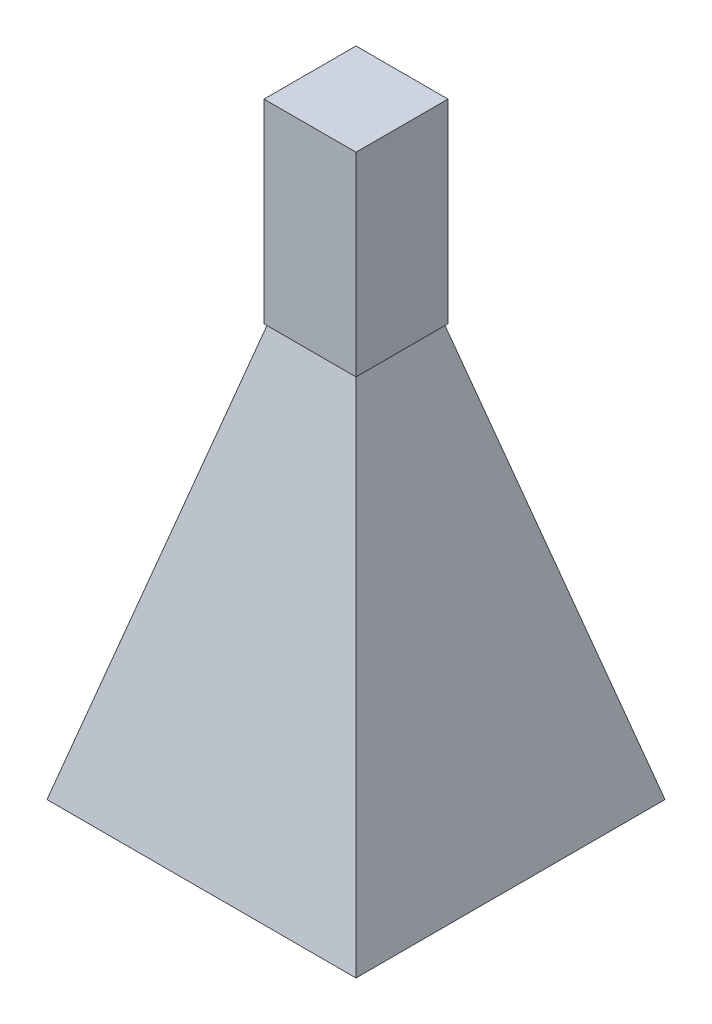
ISO-10303-21;
HEADER;
FILE_DESCRIPTION(('STEP AP214'),'2;1');
FILE_NAME('part.step','',(''),(''),'','','');
FILE_SCHEMA(('AUTOMOTIVE_DESIGN { 1 0 10303 214 1 1 1 1 }'));
ENDSEC;
DATA;
#1=APPLICATION_CONTEXT('core data for automotive mechanical design processes');
#2=APPLICATION_PROTOCOL_DEFINITION('international standard','automotive_design',2000,#1);
#3=PRODUCT_CONTEXT('',#1,'mechanical');
#4=PRODUCT('Part','Part','',(#3));
#5=PRODUCT_RELATED_PRODUCT_CATEGORY('part','',(#4));
#6=PRODUCT_DEFINITION_FORMATION('','',#4);
#7=PRODUCT_DEFINITION_CONTEXT('part definition',#1,'design');
#8=PRODUCT_DEFINITION('design','',#6,#7);
#9=PRODUCT_DEFINITION_SHAPE('','',#8);
#10=(LENGTH_UNIT() NAMED_UNIT(*) SI_UNIT(.MILLI.,.METRE.));
#11=(NAMED_UNIT(*) PLANE_ANGLE_UNIT() SI_UNIT($,.RADIAN.));
#12=(NAMED_UNIT(*) SI_UNIT($,.STERADIAN.) SOLID_ANGLE_UNIT());
#13=UNCERTAINTY_MEASURE_WITH_UNIT(LENGTH_MEASURE(1.E-05),#10,'distance_accuracy_value','');
#14=(GEOMETRIC_REPRESENTATION_CONTEXT(3) GLOBAL_UNCERTAINTY_ASSIGNED_CONTEXT((#13)) GLOBAL_UNIT_ASSIGNED_CONTEXT((#10,
#11,#12)) REPRESENTATION_CONTEXT('',''));
#15=CARTESIAN_POINT('',(0.,0.,0.));
#16=DIRECTION('',(0.,0.,1.));
#17=DIRECTION('',(1.,0.,0.));
#18=AXIS2_PLACEMENT_3D('',#15,#16,#17);
#19=CARTESIAN_POINT('',(0.,0.,-420.));
#20=DIRECTION('',(0.,0.258819045102521,-0.965925826289068));
#21=DIRECTION('',(0.,0.965925826289068,0.258819045102521));
#22=AXIS2_PLACEMENT_3D('',#19,#20,#21);
#23=PLANE('',#22);
#24=DIRECTION('',(-1.,0.,0.));
#25=VECTOR('',#24,1.);
#26=CARTESIAN_POINT('',(0.,560.,-269.948452238571));
#27=LINE('',#26,#25);
#28=CARTESIAN_POINT('',(269.948452238571,560.,-269.948452238571));
#29=VERTEX_POINT('',#28);
#30=CARTESIAN_POINT('',(150.051547761429,560.,-269.948452238571));
#31=VERTEX_POINT('',#30);
#32=EDGE_CURVE('E233',#29,#31,#27,.T.);
#33=ORIENTED_EDGE('',*,*,#32,.F.);
#34=DIRECTION('',(-0.250562807085732,0.935113126531029,0.250562807085732));
#35=VECTOR('',#34,1.);
#36=CARTESIAN_POINT('',(393.631677476234,98.4079193690586,-393.631677476234));
#37=LINE('',#36,#35);
#38=CARTESIAN_POINT('',(420.,0.,-420.));
#39=VERTEX_POINT('',#38);
#40=EDGE_CURVE('E267',#29,#39,#37,.F.);
#41=ORIENTED_EDGE('',*,*,#40,.T.);
#42=DIRECTION('',(1.,0.,0.));
#43=VECTOR('',#42,1.);
#44=CARTESIAN_POINT('',(0.,0.,-420.));
#45=LINE('',#44,#43);
#46=CARTESIAN_POINT('',(0.,0.,-420.));
#47=VERTEX_POINT('',#46);
#48=EDGE_CURVE('E250',#47,#39,#45,.T.);
#49=ORIENTED_EDGE('',*,*,#48,.F.);
#50=DIRECTION('',(-0.250562807085732,-0.935113126531029,-0.250562807085732));
#51=VECTOR('',#50,1.);
#52=CARTESIAN_POINT('',(26.3683225237664,98.4079193690586,-393.631677476234));
#53=LINE('',#52,#51);
#54=EDGE_CURVE('E42',#31,#47,#53,.T.);
#55=ORIENTED_EDGE('',*,*,#54,.F.);
#56=EDGE_LOOP('',(#33,#41,#49,#55));
#57=FACE_BOUND('',#56,.T.);
#58=ADVANCED_FACE('F33',(#57),#23,.T.);
#59=CARTESIAN_POINT('',(0.,0.,0.));
#60=DIRECTION('',(-0.965925826289068,0.258819045102521,0.));
#61=DIRECTION('',(-0.258819045102521,-0.965925826289068,0.));
#62=AXIS2_PLACEMENT_3D('',#59,#60,#61);
#63=PLANE('',#62);
#64=DIRECTION('',(0.,0.,1.));
#65=VECTOR('',#64,1.);
#66=CARTESIAN_POINT('',(150.051547761429,560.,0.));
#67=LINE('',#66,#65);
#68=CARTESIAN_POINT('',(150.051547761429,560.,-150.051547761429));
#69=VERTEX_POINT('',#68);
#70=EDGE_CURVE('E231',#31,#69,#67,.T.);
#71=ORIENTED_EDGE('',*,*,#70,.F.);
#72=ORIENTED_EDGE('',*,*,#54,.T.);
#73=DIRECTION('',(0.,0.,-1.));
#74=VECTOR('',#73,1.);
#75=CARTESIAN_POINT('',(0.,0.,0.));
#76=LINE('',#75,#74);
#77=CARTESIAN_POINT('',(0.,0.,0.));
#78=VERTEX_POINT('',#77);
#79=EDGE_CURVE('E264',#78,#47,#76,.T.);
#80=ORIENTED_EDGE('',*,*,#79,.F.);
#81=DIRECTION('',(0.250562807085732,0.935113126531029,-0.250562807085732));
#82=VECTOR('',#81,1.);
#83=CARTESIAN_POINT('',(0.,0.,0.));
#84=LINE('',#83,#82);
#85=EDGE_CURVE('E269',#69,#78,#84,.F.);
#86=ORIENTED_EDGE('',*,*,#85,.F.);
#87=EDGE_LOOP('',(#71,#72,#80,#86));
#88=FACE_BOUND('',#87,.T.);
#89=ADVANCED_FACE('F35',(#88),#63,.T.);
#90=CARTESIAN_POINT('',(0.,0.,0.));
#91=DIRECTION('',(0.,0.258819045102521,0.965925826289068));
#92=DIRECTION('',(0.,-0.965925826289068,0.258819045102521));
#93=AXIS2_PLACEMENT_3D('',#90,#91,#92);
#94=PLANE('',#93);
#95=DIRECTION('',(0.250562807085732,-0.935113126531029,0.250562807085732));
#96=VECTOR('',#95,1.);
#97=CARTESIAN_POINT('',(420.,0.,0.));
#98=LINE('',#97,#96);
#99=CARTESIAN_POINT('',(269.948452238571,560.,-150.051547761429));
#100=VERTEX_POINT('',#99);
#101=CARTESIAN_POINT('',(420.,0.,0.));
#102=VERTEX_POINT('',#101);
#103=EDGE_CURVE('E271',#100,#102,#98,.T.);
#104=ORIENTED_EDGE('',*,*,#103,.F.);
#105=DIRECTION('',(1.,0.,0.));
#106=VECTOR('',#105,1.);
#107=CARTESIAN_POINT('',(0.,560.,-150.051547761429));
#108=LINE('',#107,#106);
#109=EDGE_CURVE('E57',#100,#69,#108,.F.);
#110=ORIENTED_EDGE('',*,*,#109,.T.);
#111=ORIENTED_EDGE('',*,*,#85,.T.);
#112=DIRECTION('',(1.,0.,0.));
#113=VECTOR('',#112,1.);
#114=CARTESIAN_POINT('',(0.,0.,0.));
#115=LINE('',#114,#113);
#116=EDGE_CURVE('E261',#78,#102,#115,.T.);
#117=ORIENTED_EDGE('',*,*,#116,.T.);
#118=EDGE_LOOP('',(#104,#110,#111,#117));
#119=FACE_BOUND('',#118,.T.);
#120=ADVANCED_FACE('F277',(#119),#94,.T.);
#121=CARTESIAN_POINT('',(420.,0.,0.));
#122=DIRECTION('',(0.965925826289068,0.258819045102521,0.));
#123=DIRECTION('',(-0.258819045102521,0.965925826289068,0.));
#124=AXIS2_PLACEMENT_3D('',#121,#122,#123);
#125=PLANE('',#124);
#126=ORIENTED_EDGE('',*,*,#40,.F.);
#127=DIRECTION('',(0.,0.,-1.));
#128=VECTOR('',#127,1.);
#129=CARTESIAN_POINT('',(269.948452238571,560.,0.));
#130=LINE('',#129,#128);
#131=EDGE_CURVE('E228',#29,#100,#130,.F.);
#132=ORIENTED_EDGE('',*,*,#131,.T.);
#133=ORIENTED_EDGE('',*,*,#103,.T.);
#134=DIRECTION('',(0.,0.,-1.));
#135=VECTOR('',#134,1.);
#136=CARTESIAN_POINT('',(420.,0.,0.));
#137=LINE('',#136,#135);
#138=EDGE_CURVE('E258',#102,#39,#137,.T.);
#139=ORIENTED_EDGE('',*,*,#138,.T.);
#140=EDGE_LOOP('',(#126,#132,#133,#139));
#141=FACE_BOUND('',#140,.T.);
#142=ADVANCED_FACE('F290',(#141),#125,.T.);
#143=CARTESIAN_POINT('',(0.,0.,0.));
#144=DIRECTION('',(0.,1.,0.));
#145=DIRECTION('',(0.,0.,1.));
#146=AXIS2_PLACEMENT_3D('',#143,#144,#145);
#147=PLANE('',#146);
#148=DIRECTION('',(1.,0.,0.));
#149=VECTOR('',#148,1.);
#150=CARTESIAN_POINT('',(5.,0.,-415.));
#151=LINE('',#150,#149);
#152=CARTESIAN_POINT('',(5.,0.,-415.));
#153=VERTEX_POINT('',#152);
#154=CARTESIAN_POINT('',(415.,0.,-415.));
#155=VERTEX_POINT('',#154);
#156=EDGE_CURVE('E238',#153,#155,#151,.T.);
#157=ORIENTED_EDGE('',*,*,#156,.F.);
#158=DIRECTION('',(0.,0.,-1.));
#159=VECTOR('',#158,1.);
#160=CARTESIAN_POINT('',(5.,0.,-5.));
#161=LINE('',#160,#159);
#162=CARTESIAN_POINT('',(5.,0.,-5.));
#163=VERTEX_POINT('',#162);
#164=EDGE_CURVE('E235',#163,#153,#161,.T.);
#165=ORIENTED_EDGE('',*,*,#164,.F.);
#166=DIRECTION('',(-1.,0.,0.));
#167=VECTOR('',#166,1.);
#168=CARTESIAN_POINT('',(415.,0.,-5.));
#169=LINE('',#168,#167);
#170=CARTESIAN_POINT('',(415.,0.,-5.));
#171=VERTEX_POINT('',#170);
#172=EDGE_CURVE('E244',#171,#163,#169,.T.);
#173=ORIENTED_EDGE('',*,*,#172,.F.);
#174=DIRECTION('',(0.,0.,1.));
#175=VECTOR('',#174,1.);
#176=CARTESIAN_POINT('',(415.,0.,-415.));
#177=LINE('',#176,#175);
#178=EDGE_CURVE('E241',#155,#171,#177,.T.);
#179=ORIENTED_EDGE('',*,*,#178,.F.);
#180=EDGE_LOOP('',(#157,#165,#173,#179));
#181=FACE_BOUND('',#180,.T.);
#182=ORIENTED_EDGE('',*,*,#48,.T.);
#183=ORIENTED_EDGE('',*,*,#138,.F.);
#184=ORIENTED_EDGE('',*,*,#116,.F.);
#185=ORIENTED_EDGE('',*,*,#79,.T.);
#186=EDGE_LOOP('',(#182,#183,#184,#185));
#187=FACE_BOUND('',#186,.T.);
#188=ADVANCED_FACE('F283',(#181,#187),#147,.F.);
#189=CARTESIAN_POINT('',(5.,0.,-5.));
#190=DIRECTION('',(-0.965925826289068,0.258819045102521,0.));
#191=DIRECTION('',(-0.258819045102521,-0.965925826289068,0.));
#192=AXIS2_PLACEMENT_3D('',#189,#190,#191);
#193=PLANE('',#192);
#194=DIRECTION('',(-0.250562807085732,-0.935113126531029,-0.250562807085732));
#195=VECTOR('',#194,1.);
#196=CARTESIAN_POINT('',(30.7405053208195,96.0648736697953,-389.25949467918));
#197=LINE('',#196,#195);
#198=CARTESIAN_POINT('',(155.051547761429,560.,-264.948452238571));
#199=VERTEX_POINT('',#198);
#200=EDGE_CURVE('E247',#199,#153,#197,.T.);
#201=ORIENTED_EDGE('',*,*,#200,.F.);
#202=DIRECTION('',(0.,0.,1.));
#203=VECTOR('',#202,1.);
#204=CARTESIAN_POINT('',(155.051547761429,560.,-5.));
#205=LINE('',#204,#203);
#206=CARTESIAN_POINT('',(155.051547761429,560.,-155.051547761429));
#207=VERTEX_POINT('',#206);
#208=EDGE_CURVE('E225',#199,#207,#205,.T.);
#209=ORIENTED_EDGE('',*,*,#208,.T.);
#210=DIRECTION('',(-0.250562807085732,-0.935113126531029,0.250562807085732));
#211=VECTOR('',#210,1.);
#212=CARTESIAN_POINT('',(30.7405053208196,96.0648736697953,-30.7405053208195));
#213=LINE('',#212,#211);
#214=EDGE_CURVE('E248',#207,#163,#213,.T.);
#215=ORIENTED_EDGE('',*,*,#214,.T.);
#216=ORIENTED_EDGE('',*,*,#164,.T.);
#217=EDGE_LOOP('',(#201,#209,#215,#216));
#218=FACE_BOUND('',#217,.T.);
#219=ADVANCED_FACE('F348',(#218),#193,.F.);
#220=CARTESIAN_POINT('',(415.,0.,-5.));
#221=DIRECTION('',(0.,0.258819045102521,0.965925826289068));
#222=DIRECTION('',(0.,-0.965925826289068,0.258819045102521));
#223=AXIS2_PLACEMENT_3D('',#220,#221,#222);
#224=PLANE('',#223);
#225=ORIENTED_EDGE('',*,*,#214,.F.);
#226=DIRECTION('',(1.,0.,0.));
#227=VECTOR('',#226,1.);
#228=CARTESIAN_POINT('',(415.,560.,-155.051547761429));
#229=LINE('',#228,#227);
#230=CARTESIAN_POINT('',(264.948452238571,560.,-155.051547761429));
#231=VERTEX_POINT('',#230);
#232=EDGE_CURVE('E222',#207,#231,#229,.T.);
#233=ORIENTED_EDGE('',*,*,#232,.T.);
#234=DIRECTION('',(0.250562807085732,-0.935113126531029,0.250562807085732));
#235=VECTOR('',#234,1.);
#236=CARTESIAN_POINT('',(389.25949467918,96.0648736697953,-30.7405053208196));
#237=LINE('',#236,#235);
#238=EDGE_CURVE('E251',#231,#171,#237,.T.);
#239=ORIENTED_EDGE('',*,*,#238,.T.);
#240=ORIENTED_EDGE('',*,*,#172,.T.);
#241=EDGE_LOOP('',(#225,#233,#239,#240));
#242=FACE_BOUND('',#241,.T.);
#243=ADVANCED_FACE('F354',(#242),#224,.F.);
#244=CARTESIAN_POINT('',(415.,0.,-415.));
#245=DIRECTION('',(0.965925826289068,0.258819045102521,0.));
#246=DIRECTION('',(-0.258819045102521,0.965925826289068,0.));
#247=AXIS2_PLACEMENT_3D('',#244,#245,#246);
#248=PLANE('',#247);
#249=ORIENTED_EDGE('',*,*,#238,.F.);
#250=DIRECTION('',(0.,0.,-1.));
#251=VECTOR('',#250,1.);
#252=CARTESIAN_POINT('',(264.948452238571,560.,-415.));
#253=LINE('',#252,#251);
#254=CARTESIAN_POINT('',(264.948452238571,560.,-264.948452238571));
#255=VERTEX_POINT('',#254);
#256=EDGE_CURVE('E219',#231,#255,#253,.T.);
#257=ORIENTED_EDGE('',*,*,#256,.T.);
#258=DIRECTION('',(0.250562807085732,-0.935113126531029,-0.250562807085732));
#259=VECTOR('',#258,1.);
#260=CARTESIAN_POINT('',(389.25949467918,96.0648736697953,-389.25949467918));
#261=LINE('',#260,#259);
#262=EDGE_CURVE('E253',#255,#155,#261,.T.);
#263=ORIENTED_EDGE('',*,*,#262,.T.);
#264=ORIENTED_EDGE('',*,*,#178,.T.);
#265=EDGE_LOOP('',(#249,#257,#263,#264));
#266=FACE_BOUND('',#265,.T.);
#267=ADVANCED_FACE('F362',(#266),#248,.F.);
#268=CARTESIAN_POINT('',(5.,0.,-415.));
#269=DIRECTION('',(0.,0.258819045102521,-0.965925826289068));
#270=DIRECTION('',(0.,0.965925826289068,0.258819045102521));
#271=AXIS2_PLACEMENT_3D('',#268,#269,#270);
#272=PLANE('',#271);
#273=ORIENTED_EDGE('',*,*,#262,.F.);
#274=DIRECTION('',(-1.,0.,0.));
#275=VECTOR('',#274,1.);
#276=CARTESIAN_POINT('',(5.,560.,-264.948452238571));
#277=LINE('',#276,#275);
#278=EDGE_CURVE('E11',#255,#199,#277,.T.);
#279=ORIENTED_EDGE('',*,*,#278,.T.);
#280=ORIENTED_EDGE('',*,*,#200,.T.);
#281=ORIENTED_EDGE('',*,*,#156,.T.);
#282=EDGE_LOOP('',(#273,#279,#280,#281));
#283=FACE_BOUND('',#282,.T.);
#284=ADVANCED_FACE('F369',(#283),#272,.F.);
#285=CARTESIAN_POINT('',(0.,560.,0.));
#286=DIRECTION('',(0.,-1.,0.));
#287=DIRECTION('',(0.,0.,-1.));
#288=AXIS2_PLACEMENT_3D('',#285,#286,#287);
#289=PLANE('',#288);
#290=DIRECTION('',(-1.,0.,0.));
#291=VECTOR('',#290,1.);
#292=CARTESIAN_POINT('',(254.948452238571,560.,-165.051547761429));
#293=LINE('',#292,#291);
#294=CARTESIAN_POINT('',(254.948452238571,560.,-165.051547761429));
#295=VERTEX_POINT('',#294);
#296=CARTESIAN_POINT('',(165.051547761429,560.,-165.051547761429));
#297=VERTEX_POINT('',#296);
#298=EDGE_CURVE('E154',#295,#297,#293,.T.);
#299=ORIENTED_EDGE('',*,*,#298,.F.);
#300=DIRECTION('',(0.,0.,1.));
#301=VECTOR('',#300,1.);
#302=CARTESIAN_POINT('',(254.948452238571,560.,-254.948452238571));
#303=LINE('',#302,#301);
#304=CARTESIAN_POINT('',(254.948452238571,560.,-254.948452238571));
#305=VERTEX_POINT('',#304);
#306=EDGE_CURVE('E171',#305,#295,#303,.T.);
#307=ORIENTED_EDGE('',*,*,#306,.F.);
#308=DIRECTION('',(1.,0.,0.));
#309=VECTOR('',#308,1.);
#310=CARTESIAN_POINT('',(165.051547761429,560.,-254.948452238571));
#311=LINE('',#310,#309);
#312=CARTESIAN_POINT('',(165.051547761429,560.,-254.948452238571));
#313=VERTEX_POINT('',#312);
#314=EDGE_CURVE('E49',#313,#305,#311,.T.);
#315=ORIENTED_EDGE('',*,*,#314,.F.);
#316=DIRECTION('',(0.,0.,-1.));
#317=VECTOR('',#316,1.);
#318=CARTESIAN_POINT('',(165.051547761429,560.,-165.051547761429));
#319=LINE('',#318,#317);
#320=EDGE_CURVE('E181',#297,#313,#319,.T.);
#321=ORIENTED_EDGE('',*,*,#320,.F.);
#322=EDGE_LOOP('',(#299,#307,#315,#321));
#323=FACE_BOUND('',#322,.T.);
#324=ORIENTED_EDGE('',*,*,#208,.F.);
#325=ORIENTED_EDGE('',*,*,#278,.F.);
#326=ORIENTED_EDGE('',*,*,#256,.F.);
#327=ORIENTED_EDGE('',*,*,#232,.F.);
#328=EDGE_LOOP('',(#324,#325,#326,#327));
#329=FACE_BOUND('',#328,.T.);
#330=ADVANCED_FACE('F296',(#323,#329),#289,.T.);
#331=CARTESIAN_POINT('',(272.5,824.49,-147.5));
#332=DIRECTION('',(-1.,0.,0.));
#333=DIRECTION('',(0.,0.,1.));
#334=AXIS2_PLACEMENT_3D('',#331,#332,#333);
#335=PLANE('',#334);
#336=DIRECTION('',(0.,0.,-1.));
#337=VECTOR('',#336,1.);
#338=CARTESIAN_POINT('',(272.5,560.,-147.5));
#339=LINE('',#338,#337);
#340=CARTESIAN_POINT('',(272.5,560.,-147.5));
#341=VERTEX_POINT('',#340);
#342=CARTESIAN_POINT('',(272.5,560.,-272.5));
#343=VERTEX_POINT('',#342);
#344=EDGE_CURVE('E186',#341,#343,#339,.T.);
#345=ORIENTED_EDGE('',*,*,#344,.T.);
#346=DIRECTION('',(0.,-1.,0.));
#347=VECTOR('',#346,1.);
#348=CARTESIAN_POINT('',(272.5,824.49,-272.5));
#349=LINE('',#348,#347);
#350=CARTESIAN_POINT('',(272.5,824.49,-272.5));
#351=VERTEX_POINT('',#350);
#352=EDGE_CURVE('E216',#351,#343,#349,.T.);
#353=ORIENTED_EDGE('',*,*,#352,.F.);
#354=DIRECTION('',(0.,0.,-1.));
#355=VECTOR('',#354,1.);
#356=CARTESIAN_POINT('',(272.5,824.49,-147.5));
#357=LINE('',#356,#355);
#358=CARTESIAN_POINT('',(272.5,824.49,-147.5));
#359=VERTEX_POINT('',#358);
#360=EDGE_CURVE('E190',#359,#351,#357,.T.);
#361=ORIENTED_EDGE('',*,*,#360,.F.);
#362=DIRECTION('',(0.,-1.,0.));
#363=VECTOR('',#362,1.);
#364=CARTESIAN_POINT('',(272.5,824.49,-147.5));
#365=LINE('',#364,#363);
#366=EDGE_CURVE('E200',#359,#341,#365,.T.);
#367=ORIENTED_EDGE('',*,*,#366,.T.);
#368=EDGE_LOOP('',(#345,#353,#361,#367));
#369=FACE_BOUND('',#368,.T.);
#370=ADVANCED_FACE('F302',(#369),#335,.F.);
#371=CARTESIAN_POINT('',(147.5,824.49,-272.5));
#372=DIRECTION('',(0.,0.,1.));
#373=DIRECTION('',(1.,0.,0.));
#374=AXIS2_PLACEMENT_3D('',#371,#372,#373);
#375=PLANE('',#374);
#376=CARTESIAN_POINT('',(210.,784.,-272.5));
#377=DIRECTION('',(0.,0.,-1.));
#378=DIRECTION('',(-1.,0.,0.));
#379=AXIS2_PLACEMENT_3D('',#376,#377,#378);
#380=CIRCLE('',#379,10.);
#381=CARTESIAN_POINT('',(200.,784.,-272.5));
#382=VERTEX_POINT('',#381);
#383=EDGE_CURVE('E176',#382,#382,#380,.T.);
#384=ORIENTED_EDGE('',*,*,#383,.F.);
#385=EDGE_LOOP('',(#384));
#386=FACE_BOUND('',#385,.T.);
#387=DIRECTION('',(-1.,0.,0.));
#388=VECTOR('',#387,1.);
#389=CARTESIAN_POINT('',(147.5,560.,-272.5));
#390=LINE('',#389,#388);
#391=CARTESIAN_POINT('',(147.5,560.,-272.5));
#392=VERTEX_POINT('',#391);
#393=EDGE_CURVE('E203',#343,#392,#390,.T.);
#394=ORIENTED_EDGE('',*,*,#393,.T.);
#395=DIRECTION('',(0.,-1.,0.));
#396=VECTOR('',#395,1.);
#397=CARTESIAN_POINT('',(147.5,824.49,-272.5));
#398=LINE('',#397,#396);
#399=CARTESIAN_POINT('',(147.5,824.49,-272.5));
#400=VERTEX_POINT('',#399);
#401=EDGE_CURVE('E213',#400,#392,#398,.T.);
#402=ORIENTED_EDGE('',*,*,#401,.F.);
#403=DIRECTION('',(-1.,0.,0.));
#404=VECTOR('',#403,1.);
#405=CARTESIAN_POINT('',(147.5,824.49,-272.5));
#406=LINE('',#405,#404);
#407=EDGE_CURVE('E193',#351,#400,#406,.T.);
#408=ORIENTED_EDGE('',*,*,#407,.F.);
#409=ORIENTED_EDGE('',*,*,#352,.T.);
#410=EDGE_LOOP('',(#394,#402,#408,#409));
#411=FACE_BOUND('',#410,.T.);
#412=ADVANCED_FACE('F314',(#386,#411),#375,.F.);
#413=CARTESIAN_POINT('',(147.5,824.49,-147.5));
#414=DIRECTION('',(1.,0.,0.));
#415=DIRECTION('',(0.,0.,-1.));
#416=AXIS2_PLACEMENT_3D('',#413,#414,#415);
#417=PLANE('',#416);
#418=DIRECTION('',(0.,0.,1.));
#419=VECTOR('',#418,1.);
#420=CARTESIAN_POINT('',(147.5,560.,-147.5));
#421=LINE('',#420,#419);
#422=CARTESIAN_POINT('',(147.5,560.,-147.5));
#423=VERTEX_POINT('',#422);
#424=EDGE_CURVE('E205',#392,#423,#421,.T.);
#425=ORIENTED_EDGE('',*,*,#424,.T.);
#426=DIRECTION('',(0.,-1.,0.));
#427=VECTOR('',#426,1.);
#428=CARTESIAN_POINT('',(147.5,824.49,-147.5));
#429=LINE('',#428,#427);
#430=CARTESIAN_POINT('',(147.5,824.49,-147.5));
#431=VERTEX_POINT('',#430);
#432=EDGE_CURVE('E210',#431,#423,#429,.T.);
#433=ORIENTED_EDGE('',*,*,#432,.F.);
#434=DIRECTION('',(0.,0.,1.));
#435=VECTOR('',#434,1.);
#436=CARTESIAN_POINT('',(147.5,824.49,-147.5));
#437=LINE('',#436,#435);
#438=EDGE_CURVE('E196',#400,#431,#437,.T.);
#439=ORIENTED_EDGE('',*,*,#438,.F.);
#440=ORIENTED_EDGE('',*,*,#401,.T.);
#441=EDGE_LOOP('',(#425,#433,#439,#440));
#442=FACE_BOUND('',#441,.T.);
#443=ADVANCED_FACE('F311',(#442),#417,.F.);
#444=CARTESIAN_POINT('',(147.5,824.49,-147.5));
#445=DIRECTION('',(0.,0.,-1.));
#446=DIRECTION('',(-1.,0.,0.));
#447=AXIS2_PLACEMENT_3D('',#444,#445,#446);
#448=PLANE('',#447);
#449=DIRECTION('',(1.,0.,0.));
#450=VECTOR('',#449,1.);
#451=CARTESIAN_POINT('',(147.5,560.,-147.5));
#452=LINE('',#451,#450);
#453=EDGE_CURVE('E194',#423,#341,#452,.T.);
#454=ORIENTED_EDGE('',*,*,#453,.T.);
#455=ORIENTED_EDGE('',*,*,#366,.F.);
#456=DIRECTION('',(1.,0.,0.));
#457=VECTOR('',#456,1.);
#458=CARTESIAN_POINT('',(147.5,824.49,-147.5));
#459=LINE('',#458,#457);
#460=EDGE_CURVE('E198',#431,#359,#459,.T.);
#461=ORIENTED_EDGE('',*,*,#460,.F.);
#462=ORIENTED_EDGE('',*,*,#432,.T.);
#463=EDGE_LOOP('',(#454,#455,#461,#462));
#464=FACE_BOUND('',#463,.T.);
#465=ADVANCED_FACE('F307',(#464),#448,.F.);
#466=CARTESIAN_POINT('',(0.,824.49,0.));
#467=DIRECTION('',(0.,-1.,0.));
#468=DIRECTION('',(0.,0.,-1.));
#469=AXIS2_PLACEMENT_3D('',#466,#467,#468);
#470=PLANE('',#469);
#471=ORIENTED_EDGE('',*,*,#360,.T.);
#472=ORIENTED_EDGE('',*,*,#407,.T.);
#473=ORIENTED_EDGE('',*,*,#438,.T.);
#474=ORIENTED_EDGE('',*,*,#460,.T.);
#475=EDGE_LOOP('',(#471,#472,#473,#474));
#476=FACE_BOUND('',#475,.T.);
#477=ADVANCED_FACE('F294',(#476),#470,.F.);
#478=ORIENTED_EDGE('',*,*,#131,.F.);
#479=ORIENTED_EDGE('',*,*,#32,.T.);
#480=ORIENTED_EDGE('',*,*,#70,.T.);
#481=ORIENTED_EDGE('',*,*,#109,.F.);
#482=EDGE_LOOP('',(#478,#479,#480,#481));
#483=FACE_BOUND('',#482,.T.);
#484=ORIENTED_EDGE('',*,*,#344,.F.);
#485=ORIENTED_EDGE('',*,*,#453,.F.);
#486=ORIENTED_EDGE('',*,*,#424,.F.);
#487=ORIENTED_EDGE('',*,*,#393,.F.);
#488=EDGE_LOOP('',(#484,#485,#486,#487));
#489=FACE_BOUND('',#488,.T.);
#490=ADVANCED_FACE('F291',(#483,#489),#289,.T.);
#491=CARTESIAN_POINT('',(254.948452238571,808.49,-165.051547761429));
#492=DIRECTION('',(0.,0.,1.));
#493=DIRECTION('',(1.,0.,0.));
#494=AXIS2_PLACEMENT_3D('',#491,#492,#493);
#495=PLANE('',#494);
#496=ORIENTED_EDGE('',*,*,#298,.T.);
#497=DIRECTION('',(0.,-1.,0.));
#498=VECTOR('',#497,1.);
#499=CARTESIAN_POINT('',(165.051547761429,808.49,-165.051547761429));
#500=LINE('',#499,#498);
#501=CARTESIAN_POINT('',(165.051547761429,808.49,-165.051547761429));
#502=VERTEX_POINT('',#501);
#503=EDGE_CURVE('E147',#502,#297,#500,.T.);
#504=ORIENTED_EDGE('',*,*,#503,.F.);
#505=DIRECTION('',(-1.,0.,0.));
#506=VECTOR('',#505,1.);
#507=CARTESIAN_POINT('',(254.948452238571,808.49,-165.051547761429));
#508=LINE('',#507,#506);
#509=CARTESIAN_POINT('',(254.948452238571,808.49,-165.051547761429));
#510=VERTEX_POINT('',#509);
#511=EDGE_CURVE('E151',#510,#502,#508,.T.);
#512=ORIENTED_EDGE('',*,*,#511,.F.);
#513=DIRECTION('',(0.,-1.,0.));
#514=VECTOR('',#513,1.);
#515=CARTESIAN_POINT('',(254.948452238571,808.49,-165.051547761429));
#516=LINE('',#515,#514);
#517=EDGE_CURVE('E184',#510,#295,#516,.T.);
#518=ORIENTED_EDGE('',*,*,#517,.T.);
#519=EDGE_LOOP('',(#496,#504,#512,#518));
#520=FACE_BOUND('',#519,.T.);
#521=ADVANCED_FACE('F149',(#520),#495,.F.);
#522=CARTESIAN_POINT('',(254.948452238571,808.49,-254.948452238571));
#523=DIRECTION('',(1.,0.,0.));
#524=DIRECTION('',(0.,0.,-1.));
#525=AXIS2_PLACEMENT_3D('',#522,#523,#524);
#526=PLANE('',#525);
#527=ORIENTED_EDGE('',*,*,#306,.T.);
#528=ORIENTED_EDGE('',*,*,#517,.F.);
#529=DIRECTION('',(0.,0.,1.));
#530=VECTOR('',#529,1.);
#531=CARTESIAN_POINT('',(254.948452238571,808.49,-254.948452238571));
#532=LINE('',#531,#530);
#533=CARTESIAN_POINT('',(254.948452238571,808.49,-254.948452238571));
#534=VERTEX_POINT('',#533);
#535=EDGE_CURVE('E159',#534,#510,#532,.T.);
#536=ORIENTED_EDGE('',*,*,#535,.F.);
#537=DIRECTION('',(0.,-1.,0.));
#538=VECTOR('',#537,1.);
#539=CARTESIAN_POINT('',(254.948452238571,808.49,-254.948452238571));
#540=LINE('',#539,#538);
#541=EDGE_CURVE('E187',#534,#305,#540,.T.);
#542=ORIENTED_EDGE('',*,*,#541,.T.);
#543=EDGE_LOOP('',(#527,#528,#536,#542));
#544=FACE_BOUND('',#543,.T.);
#545=ADVANCED_FACE('F428',(#544),#526,.F.);
#546=CARTESIAN_POINT('',(165.051547761429,808.49,-254.948452238571));
#547=DIRECTION('',(0.,0.,-1.));
#548=DIRECTION('',(-1.,0.,0.));
#549=AXIS2_PLACEMENT_3D('',#546,#547,#548);
#550=PLANE('',#549);
#551=CARTESIAN_POINT('',(210.,784.,-254.948452238571));
#552=DIRECTION('',(0.,0.,-1.));
#553=DIRECTION('',(-1.,0.,0.));
#554=AXIS2_PLACEMENT_3D('',#551,#552,#553);
#555=CIRCLE('',#554,10.);
#556=CARTESIAN_POINT('',(200.,784.,-254.948452238571));
#557=VERTEX_POINT('',#556);
#558=EDGE_CURVE('E37',#557,#557,#555,.T.);
#559=ORIENTED_EDGE('',*,*,#558,.T.);
#560=EDGE_LOOP('',(#559));
#561=FACE_BOUND('',#560,.T.);
#562=ORIENTED_EDGE('',*,*,#314,.T.);
#563=ORIENTED_EDGE('',*,*,#541,.F.);
#564=DIRECTION('',(1.,0.,0.));
#565=VECTOR('',#564,1.);
#566=CARTESIAN_POINT('',(165.051547761429,808.49,-254.948452238571));
#567=LINE('',#566,#565);
#568=CARTESIAN_POINT('',(165.051547761429,808.49,-254.948452238571));
#569=VERTEX_POINT('',#568);
#570=EDGE_CURVE('E167',#569,#534,#567,.T.);
#571=ORIENTED_EDGE('',*,*,#570,.F.);
#572=DIRECTION('',(0.,-1.,0.));
#573=VECTOR('',#572,1.);
#574=CARTESIAN_POINT('',(165.051547761429,808.49,-254.948452238571));
#575=LINE('',#574,#573);
#576=EDGE_CURVE('E158',#569,#313,#575,.T.);
#577=ORIENTED_EDGE('',*,*,#576,.T.);
#578=EDGE_LOOP('',(#562,#563,#571,#577));
#579=FACE_BOUND('',#578,.T.);
#580=ADVANCED_FACE('F433',(#561,#579),#550,.F.);
#581=CARTESIAN_POINT('',(165.051547761429,808.49,-165.051547761429));
#582=DIRECTION('',(-1.,0.,0.));
#583=DIRECTION('',(0.,0.,1.));
#584=AXIS2_PLACEMENT_3D('',#581,#582,#583);
#585=PLANE('',#584);
#586=ORIENTED_EDGE('',*,*,#320,.T.);
#587=ORIENTED_EDGE('',*,*,#576,.F.);
#588=DIRECTION('',(0.,0.,-1.));
#589=VECTOR('',#588,1.);
#590=CARTESIAN_POINT('',(165.051547761429,808.49,-165.051547761429));
#591=LINE('',#590,#589);
#592=EDGE_CURVE('E162',#502,#569,#591,.T.);
#593=ORIENTED_EDGE('',*,*,#592,.F.);
#594=ORIENTED_EDGE('',*,*,#503,.T.);
#595=EDGE_LOOP('',(#586,#587,#593,#594));
#596=FACE_BOUND('',#595,.T.);
#597=ADVANCED_FACE('F163',(#596),#585,.F.);
#598=CARTESIAN_POINT('',(0.,808.49,0.));
#599=DIRECTION('',(0.,-1.,0.));
#600=DIRECTION('',(0.,0.,-1.));
#601=AXIS2_PLACEMENT_3D('',#598,#599,#600);
#602=PLANE('',#601);
#603=ORIENTED_EDGE('',*,*,#511,.T.);
#604=ORIENTED_EDGE('',*,*,#592,.T.);
#605=ORIENTED_EDGE('',*,*,#570,.T.);
#606=ORIENTED_EDGE('',*,*,#535,.T.);
#607=EDGE_LOOP('',(#603,#604,#605,#606));
#608=FACE_BOUND('',#607,.T.);
#609=ADVANCED_FACE('F169',(#608),#602,.T.);
#610=CARTESIAN_POINT('',(210.,784.,-240.01));
#611=DIRECTION('',(0.,0.,-1.));
#612=DIRECTION('',(-1.,0.,0.));
#613=AXIS2_PLACEMENT_3D('',#610,#611,#612);
#614=CYLINDRICAL_SURFACE('',#613,10.);
#615=ORIENTED_EDGE('',*,*,#383,.T.);
#616=EDGE_LOOP('',(#615));
#617=FACE_BOUND('',#616,.T.);
#618=ORIENTED_EDGE('',*,*,#558,.F.);
#619=EDGE_LOOP('',(#618));
#620=FACE_BOUND('',#619,.T.);
#621=ADVANCED_FACE('F453',(#617,#620),#614,.F.);
#622=CLOSED_SHELL('',(#58,#89,#120,#142,#188,#219,#243,#267,#284,#330,#370,#412,#443,#465,#477,
#490,#521,#545,#580,#597,#609,#621));
#623=MANIFOLD_SOLID_BREP('B2',#622);
#624=ADVANCED_BREP_SHAPE_REPRESENTATION('',(#18,#623),#14);
#625=SHAPE_DEFINITION_REPRESENTATION(#9,#624);
ENDSEC;
END-ISO-10303-21;
